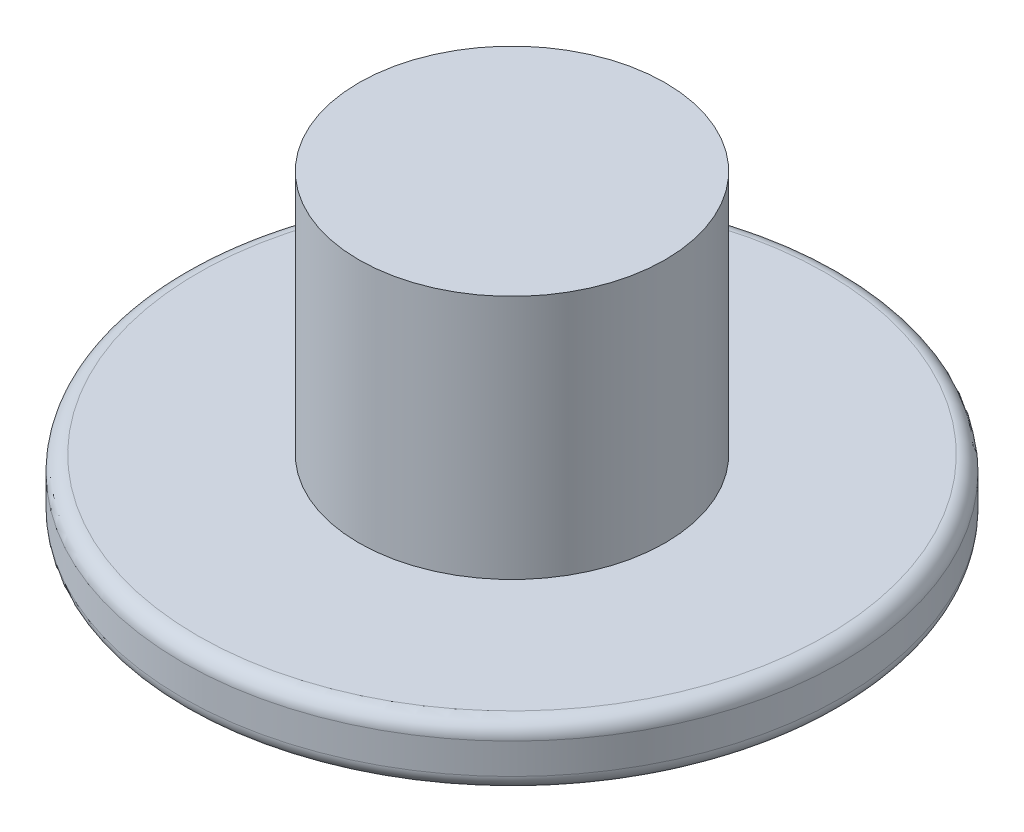
ISO-10303-21;
HEADER;
FILE_DESCRIPTION(('STEP AP214'),'2;1');
FILE_NAME('part.step','',(''),(''),'','','');
FILE_SCHEMA(('AUTOMOTIVE_DESIGN { 1 0 10303 214 1 1 1 1 }'));
ENDSEC;
DATA;
#1=APPLICATION_CONTEXT('core data for automotive mechanical design processes');
#2=APPLICATION_PROTOCOL_DEFINITION('international standard','automotive_design',2000,#1);
#3=PRODUCT_CONTEXT('',#1,'mechanical');
#4=PRODUCT('Part','Part','',(#3));
#5=PRODUCT_RELATED_PRODUCT_CATEGORY('part','',(#4));
#6=PRODUCT_DEFINITION_FORMATION('','',#4);
#7=PRODUCT_DEFINITION_CONTEXT('part definition',#1,'design');
#8=PRODUCT_DEFINITION('design','',#6,#7);
#9=PRODUCT_DEFINITION_SHAPE('','',#8);
#10=(LENGTH_UNIT() NAMED_UNIT(*) SI_UNIT(.MILLI.,.METRE.));
#11=(NAMED_UNIT(*) PLANE_ANGLE_UNIT() SI_UNIT($,.RADIAN.));
#12=(NAMED_UNIT(*) SI_UNIT($,.STERADIAN.) SOLID_ANGLE_UNIT());
#13=UNCERTAINTY_MEASURE_WITH_UNIT(LENGTH_MEASURE(1.E-05),#10,'distance_accuracy_value','');
#14=(GEOMETRIC_REPRESENTATION_CONTEXT(3) GLOBAL_UNCERTAINTY_ASSIGNED_CONTEXT((#13)) GLOBAL_UNIT_ASSIGNED_CONTEXT((#10,
#11,#12)) REPRESENTATION_CONTEXT('',''));
#15=CARTESIAN_POINT('',(0.,0.,0.));
#16=DIRECTION('',(0.,0.,1.));
#17=DIRECTION('',(1.,0.,0.));
#18=AXIS2_PLACEMENT_3D('',#15,#16,#17);
#19=CARTESIAN_POINT('',(-5.40867619744746,0.,40.306737900425));
#20=DIRECTION('',(0.,1.,0.));
#21=DIRECTION('',(0.,0.,1.));
#22=AXIS2_PLACEMENT_3D('',#19,#20,#21);
#23=PLANE('',#22);
#24=CARTESIAN_POINT('',(-5.40867619744746,0.,40.306737900425));
#25=DIRECTION('',(0.,1.,0.));
#26=DIRECTION('',(0.,0.,1.));
#27=AXIS2_PLACEMENT_3D('',#24,#25,#26);
#28=CIRCLE('',#27,10.25);
#29=CARTESIAN_POINT('',(-5.40867619744746,0.,50.556737900425));
#30=VERTEX_POINT('',#29);
#31=EDGE_CURVE('E11',#30,#30,#28,.F.);
#32=ORIENTED_EDGE('',*,*,#31,.T.);
#33=EDGE_LOOP('',(#32));
#34=FACE_BOUND('',#33,.T.);
#35=DIRECTION('',(1.,0.,0.));
#36=VECTOR('',#35,1.);
#37=CARTESIAN_POINT('',(-6.73019068146306,0.,44.8370687061921));
#38=LINE('',#37,#36);
#39=CARTESIAN_POINT('',(-6.73019068146306,0.,44.8370687061921));
#40=VERTEX_POINT('',#39);
#41=CARTESIAN_POINT('',(-1.1192131173605,0.,44.8370687061921));
#42=VERTEX_POINT('',#41);
#43=EDGE_CURVE('E55',#40,#42,#38,.T.);
#44=ORIENTED_EDGE('',*,*,#43,.T.);
#45=DIRECTION('',(0.,0.,-1.));
#46=VECTOR('',#45,1.);
#47=CARTESIAN_POINT('',(-1.1192131173605,0.,44.8370687061921));
#48=LINE('',#47,#46);
#49=CARTESIAN_POINT('',(-1.1192131173605,0.,43.6832225523459));
#50=VERTEX_POINT('',#49);
#51=EDGE_CURVE('E383',#42,#50,#48,.T.);
#52=ORIENTED_EDGE('',*,*,#51,.T.);
#53=DIRECTION('',(-1.,0.,0.));
#54=VECTOR('',#53,1.);
#55=CARTESIAN_POINT('',(-1.1192131173605,0.,43.6832225523459));
#56=LINE('',#55,#54);
#57=CARTESIAN_POINT('',(-5.34397273274512,0.,43.6832225523459));
#58=VERTEX_POINT('',#57);
#59=EDGE_CURVE('E386',#50,#58,#56,.T.);
#60=ORIENTED_EDGE('',*,*,#59,.T.);
#61=DIRECTION('',(-0.27333643752184,0.,-0.961918495467713));
#62=VECTOR('',#61,1.);
#63=CARTESIAN_POINT('',(-5.34397273274512,0.,43.6832225523459));
#64=LINE('',#63,#62);
#65=CARTESIAN_POINT('',(-6.02305927120665,0.,41.2933988343972));
#66=VERTEX_POINT('',#65);
#67=EDGE_CURVE('E391',#58,#66,#64,.T.);
#68=ORIENTED_EDGE('',*,*,#67,.T.);
#69=CARTESIAN_POINT('',(-6.02305927120665,0.,41.2933988343972));
#70=CARTESIAN_POINT('',(-5.93215657111115,0.,41.3260066823905));
#71=CARTESIAN_POINT('',(-5.74832799375601,0.,41.3919481153833));
#72=CARTESIAN_POINT('',(-5.45735597615816,0.,41.4570733809796));
#73=CARTESIAN_POINT('',(-5.1526801826961,0.,41.4949218039044));
#74=CARTESIAN_POINT('',(-4.94477683204518,0.,41.5007664036376));
#75=CARTESIAN_POINT('',(-4.83916504043742,0.,41.5037353728588));
#76=B_SPLINE_CURVE_WITH_KNOTS('',3,(#69,#70,#71,#72,#73,#74,#75),.UNSPECIFIED.,.F.,.F.,(4,1,1,1,
4),(0.,0.239429262692697,0.484187385982473,0.737974909352279,1.),.UNSPECIFIED.);
#77=CARTESIAN_POINT('',(-4.83916504043742,0.,41.5037353728588));
#78=VERTEX_POINT('',#77);
#79=EDGE_CURVE('E395',#66,#78,#76,.T.);
#80=ORIENTED_EDGE('',*,*,#79,.T.);
#81=CARTESIAN_POINT('',(-4.83916504043742,0.,41.5037353728588));
#82=CARTESIAN_POINT('',(-4.6927948440553,0.,41.5015117046549));
#83=CARTESIAN_POINT('',(-4.40530243396048,0.,41.4971440960365));
#84=CARTESIAN_POINT('',(-3.98491468512495,0.,41.4490227793062));
#85=CARTESIAN_POINT('',(-3.5841143930784,0.,41.3760350578371));
#86=CARTESIAN_POINT('',(-3.20340957642049,0.,41.2724287059942));
#87=CARTESIAN_POINT('',(-2.84410494047985,0.,41.1349601433638));
#88=CARTESIAN_POINT('',(-2.50342224904487,0.,40.9708336778564));
#89=CARTESIAN_POINT('',(-2.18343063076139,0.,40.7755046147159));
#90=CARTESIAN_POINT('',(-1.88673504524433,0.,40.5522039643542));
#91=CARTESIAN_POINT('',(-1.61761416693961,0.,40.3075602114748));
#92=CARTESIAN_POINT('',(-1.38056250436114,0.,40.0462120709497));
#93=CARTESIAN_POINT('',(-1.18207177955775,0.,39.76870832662));
#94=CARTESIAN_POINT('',(-1.0165866631122,0.,39.4774777608867));
#95=CARTESIAN_POINT('',(-0.891019309772605,0.,39.1701050934345));
#96=CARTESIAN_POINT('',(-0.800035696125023,0.,38.848376848342));
#97=CARTESIAN_POINT('',(-0.744603565608385,0.,38.5122000800234));
#98=CARTESIAN_POINT('',(-0.737965639625989,0.,38.282791456088));
#99=CARTESIAN_POINT('',(-0.734597732745115,0.,38.166395629269));
#100=B_SPLINE_CURVE_WITH_KNOTS('',3,(#81,#82,#83,#84,#85,#86,#87,#88,#89,#90,#91,#92,#93,#94,
#95,#96,#97,#98,#99),.UNSPECIFIED.,.F.,.F.,(4,1,1,1,1,1,1,1,1,1,1,1,1,1,1,1,4),(0.,
0.0743389245753018,0.146012488322517,0.214685074506793,0.281190543308888,0.346155068067732,
0.409885297502125,0.473075910884056,0.536316597878801,0.59827844891465,0.657616470310781,
0.715238120651402,0.771292284799635,0.827429553758731,0.883492957858258,0.940887429305456,1.),.UNSPECIFIED.);
#101=CARTESIAN_POINT('',(-0.734597732745115,0.,38.166395629269));
#102=VERTEX_POINT('',#101);
#103=EDGE_CURVE('E401',#78,#102,#100,.T.);
#104=ORIENTED_EDGE('',*,*,#103,.T.);
#105=CARTESIAN_POINT('',(-0.734597732745115,0.,38.166395629269));
#106=CARTESIAN_POINT('',(-0.736640176708579,0.,38.085517838444));
#107=CARTESIAN_POINT('',(-0.740703433824927,0.,37.9246188052256));
#108=CARTESIAN_POINT('',(-0.769785302849158,0.,37.6855396597018));
#109=CARTESIAN_POINT('',(-0.815472566024547,0.,37.4510645665252));
#110=CARTESIAN_POINT('',(-0.880132403892247,0.,37.2204997671261));
#111=CARTESIAN_POINT('',(-0.96412582099436,0.,36.9948085430344));
#112=CARTESIAN_POINT('',(-1.06783673984658,0.,36.7731466929799));
#113=CARTESIAN_POINT('',(-1.18705446464345,0.,36.5544348686205));
#114=CARTESIAN_POINT('',(-1.32771342288352,0.,36.3429885347051));
#115=CARTESIAN_POINT('',(-1.48406860437464,0.,36.1398632955829));
#116=CARTESIAN_POINT('',(-1.65127487718054,0.,35.9438898850625));
#117=CARTESIAN_POINT('',(-1.83698238790032,0.,35.7638483966773));
#118=CARTESIAN_POINT('',(-2.03629724836563,0.,35.5952945193468));
#119=CARTESIAN_POINT('',(-2.24765163916629,0.,35.4369335975072));
#120=CARTESIAN_POINT('',(-2.47453894318062,0.,35.2921645696468));
#121=CARTESIAN_POINT('',(-2.71396984655679,0.,35.1575764293281));
#122=CARTESIAN_POINT('',(-2.96910054443274,0.,35.0383196757167));
#123=CARTESIAN_POINT('',(-3.23450294933087,0.,34.9305693633146));
#124=CARTESIAN_POINT('',(-3.51018020912839,0.,34.8350953287018));
#125=CARTESIAN_POINT('',(-3.79637120120223,0.,34.7581644610804));
#126=CARTESIAN_POINT('',(-4.09203422681157,0.,34.6943677218742));
#127=CARTESIAN_POINT('',(-4.39652846494206,0.,34.6413106249043));
#128=CARTESIAN_POINT('',(-4.71090790143422,0.,34.605736686545));
#129=CARTESIAN_POINT('',(-5.03522687383082,0.,34.5861160931961));
#130=CARTESIAN_POINT('',(-5.25447061639936,0.,34.5824987338237));
#131=CARTESIAN_POINT('',(-5.36600798915537,0.,34.5806584497818));
#132=B_SPLINE_CURVE_WITH_KNOTS('',3,(#105,#106,#107,#108,#109,#110,#111,#112,#113,#114,#115,
#116,#117,#118,#119,#120,#121,#122,#123,#124,#125,#126,#127,#128,#129,#130,#131),.UNSPECIFIED.,
.F.,.F.,(4,1,1,1,1,1,1,1,1,1,1,1,1,1,1,1,1,1,1,1,1,1,1,1,4),(0.,0.0371714568856347,
0.0739492438555975,0.110548562269402,0.146892145996795,0.183894672594179,0.221110457371372,
0.259300773030149,0.298290633884369,0.337703474048405,0.377088815071421,0.416592385829035,
0.456443813643032,0.497021491109182,0.537889512706286,0.580074529466974,0.623187334398457,
0.667246883884079,0.711703436595568,0.757198971041948,0.803375874273611,0.850708398715815,
0.899213688248716,0.948726288418507,1.),.UNSPECIFIED.);
#133=CARTESIAN_POINT('',(-5.36600798915537,0.,34.5806584497818));
#134=VERTEX_POINT('',#133);
#135=EDGE_CURVE('E410',#102,#134,#132,.T.);
#136=ORIENTED_EDGE('',*,*,#135,.T.);
#137=CARTESIAN_POINT('',(-5.36600798915537,0.,34.5806584497819));
#138=CARTESIAN_POINT('',(-5.49428448627442,0.,34.583063857957));
#139=CARTESIAN_POINT('',(-5.7459559564439,0.,34.5877831372123));
#140=CARTESIAN_POINT('',(-6.11618420193414,0.,34.6220348205228));
#141=CARTESIAN_POINT('',(-6.47081652048435,0.,34.6801783982232));
#142=CARTESIAN_POINT('',(-6.81126631620235,0.,34.7598845139597));
#143=CARTESIAN_POINT('',(-7.1368932364796,0.,34.8642338454057));
#144=CARTESIAN_POINT('',(-7.44756847050547,0.,34.9925641976192));
#145=CARTESIAN_POINT('',(-7.7430905227615,0.,35.1431432902438));
#146=CARTESIAN_POINT('',(-8.02175502307017,0.,35.3151196060361));
#147=CARTESIAN_POINT('',(-8.2802632831459,0.,35.5077495311885));
#148=CARTESIAN_POINT('',(-8.51132832701484,0.,35.7238222338236));
#149=CARTESIAN_POINT('',(-8.71730290700243,0.,35.9563985513301));
#150=CARTESIAN_POINT('',(-8.89412481187854,0.,36.2089896982644));
#151=CARTESIAN_POINT('',(-9.0461122197022,0.,36.4787574043959));
#152=CARTESIAN_POINT('',(-9.16773086314077,0.,36.7686954136162));
#153=CARTESIAN_POINT('',(-9.26333166459999,0.,37.0774077643959));
#154=CARTESIAN_POINT('',(-9.30373865943081,0.,37.2918379179483));
#155=CARTESIAN_POINT('',(-9.32434132248871,0.,37.4011712702947));
#156=B_SPLINE_CURVE_WITH_KNOTS('',3,(#137,#138,#139,#140,#141,#142,#143,#144,#145,#146,#147,
#148,#149,#150,#151,#152,#153,#154,#155),.UNSPECIFIED.,.F.,.F.,(4,1,1,1,1,1,1,1,1,1,1,1,1,1,1,1,
4),(0.,0.0722550693364355,0.141760493430237,0.20922582661214,0.274550614369714,
0.338548322441237,0.401625248301819,0.46369940891637,0.525181550155835,0.585891378212693,
0.644976062496838,0.703077965727782,0.760578940010147,0.81834014546035,0.877164440445626,
0.93736877351003,1.),.UNSPECIFIED.);
#157=CARTESIAN_POINT('',(-9.32434132248871,0.,37.4011712702947));
#158=VERTEX_POINT('',#157);
#159=EDGE_CURVE('E419',#134,#158,#156,.T.);
#160=ORIENTED_EDGE('',*,*,#159,.T.);
#161=DIRECTION('',(1.,0.,0.));
#162=VECTOR('',#161,1.);
#163=CARTESIAN_POINT('',(-9.32434132248871,0.,37.4011712702947));
#164=LINE('',#163,#162);
#165=CARTESIAN_POINT('',(-7.69573555325794,0.,37.4011712702947));
#166=VERTEX_POINT('',#165);
#167=EDGE_CURVE('E428',#158,#166,#164,.T.);
#168=ORIENTED_EDGE('',*,*,#167,.T.);
#169=CARTESIAN_POINT('',(-7.69573555325794,0.,37.4011712702947));
#170=CARTESIAN_POINT('',(-7.6659388415858,0.,37.2982277299299));
#171=CARTESIAN_POINT('',(-7.60942475923508,0.,37.1029793487776));
#172=CARTESIAN_POINT('',(-7.49438667741095,0.,36.8371311331461));
#173=CARTESIAN_POINT('',(-7.36557869267887,0.,36.6106821435882));
#174=CARTESIAN_POINT('',(-7.21298136460262,0.,36.4246477011935));
#175=CARTESIAN_POINT('',(-7.03724454167315,0.,36.2711862733975));
#176=CARTESIAN_POINT('',(-6.83788668293426,0.,36.1400331030069));
#177=CARTESIAN_POINT('',(-6.61753110984514,0.,36.0180322380898));
#178=CARTESIAN_POINT('',(-6.37223107237868,0.,35.9184550204022));
#179=CARTESIAN_POINT('',(-6.11302822056004,0.,35.8367159002311));
#180=CARTESIAN_POINT('',(-5.8440518502742,0.,35.7789765210099));
#181=CARTESIAN_POINT('',(-5.56940602731092,0.,35.7411853601481));
#182=CARTESIAN_POINT('',(-5.38349392346399,0.,35.7367419062204));
#183=CARTESIAN_POINT('',(-5.28988619428358,0.,35.734504603628));
#184=B_SPLINE_CURVE_WITH_KNOTS('',3,(#169,#170,#171,#172,#173,#174,#175,#176,#177,#178,#179,
#180,#181,#182,#183),.UNSPECIFIED.,.F.,.F.,(4,1,1,1,1,1,1,1,1,1,1,1,4),(0.,0.100791051963254,
0.191165853250663,0.27201810378698,0.345255267649142,0.416507285315301,0.490772991013227,
0.569531127070008,0.65322621517471,0.739506009827779,0.825068479735341,0.911921052824323,1.),.UNSPECIFIED.);
#185=CARTESIAN_POINT('',(-5.28988619428358,0.,35.734504603628));
#186=VERTEX_POINT('',#185);
#187=EDGE_CURVE('E435',#166,#186,#184,.T.);
#188=ORIENTED_EDGE('',*,*,#187,.T.);
#189=CARTESIAN_POINT('',(-5.28988619428358,0.,35.734504603628));
#190=CARTESIAN_POINT('',(-5.19232400485212,0.,35.7371308106666));
#191=CARTESIAN_POINT('',(-5.00001608623491,0.,35.7423074104578));
#192=CARTESIAN_POINT('',(-4.71691034473578,0.,35.7737505793307));
#193=CARTESIAN_POINT('',(-4.4449659311084,0.,35.8305591133987));
#194=CARTESIAN_POINT('',(-4.18350813090624,0.,35.9087701891085));
#195=CARTESIAN_POINT('',(-3.93247715919748,0.,36.0087804418865));
#196=CARTESIAN_POINT('',(-3.69275479914498,0.,36.1321229679419));
#197=CARTESIAN_POINT('',(-3.46376649605635,0.,36.2763868965542));
#198=CARTESIAN_POINT('',(-3.24901409277233,0.,36.4419556021416));
#199=CARTESIAN_POINT('',(-3.05146790974454,0.,36.623085173375));
#200=CARTESIAN_POINT('',(-2.8760184649891,0.,36.8160022228656));
#201=CARTESIAN_POINT('',(-2.73088097116678,0.,37.0236889638669));
#202=CARTESIAN_POINT('',(-2.6090820006183,0.,37.239620566169));
#203=CARTESIAN_POINT('',(-2.51776177272255,0.,37.4685644527969));
#204=CARTESIAN_POINT('',(-2.44745588639938,0.,37.7054284544355));
#205=CARTESIAN_POINT('',(-2.41020035351009,0.,37.954886601776));
#206=CARTESIAN_POINT('',(-2.40427985968689,0.,38.1242201808337));
#207=CARTESIAN_POINT('',(-2.40126439941178,0.,38.2104661420895));
#208=B_SPLINE_CURVE_WITH_KNOTS('',3,(#189,#190,#191,#192,#193,#194,#195,#196,#197,#198,#199,
#200,#201,#202,#203,#204,#205,#206,#207),.UNSPECIFIED.,.F.,.F.,(4,1,1,1,1,1,1,1,1,1,1,1,1,1,1,1,
4),(0.,0.0691660997840869,0.136335487814075,0.201596475431935,0.265840184658442,
0.329565649797417,0.392862493107134,0.456684571921118,0.52115804696228,0.584807875628129,
0.646484027775238,0.705581540802134,0.764061651384216,0.821811177654662,0.879937745098238,
0.938849195521886,1.),.UNSPECIFIED.);
#209=CARTESIAN_POINT('',(-2.40126439941178,0.,38.2104661420895));
#210=VERTEX_POINT('',#209);
#211=EDGE_CURVE('E441',#186,#210,#208,.T.);
#212=ORIENTED_EDGE('',*,*,#211,.T.);
#213=CARTESIAN_POINT('',(-2.40126439941178,0.,38.2104661420895));
#214=CARTESIAN_POINT('',(-2.40349869004694,0.,38.2873966041747));
#215=CARTESIAN_POINT('',(-2.40789561081065,0.,38.4387901340862));
#216=CARTESIAN_POINT('',(-2.44492134610032,0.,38.6607096451391));
#217=CARTESIAN_POINT('',(-2.50534816984183,0.,38.8714212778116));
#218=CARTESIAN_POINT('',(-2.58686473561244,0.,39.0724804067537));
#219=CARTESIAN_POINT('',(-2.6975292165411,0.,39.2591245665785));
#220=CARTESIAN_POINT('',(-2.82817575057708,0.,39.4377812787495));
#221=CARTESIAN_POINT('',(-2.98541285842316,0.,39.6032635850109));
#222=CARTESIAN_POINT('',(-3.16407031568093,0.,39.7572458112678));
#223=CARTESIAN_POINT('',(-3.36148755009186,0.,39.8981960904131));
#224=CARTESIAN_POINT('',(-3.57994685646756,0.,40.0171557767739));
#225=CARTESIAN_POINT('',(-3.81224482640179,0.,40.122529309504));
#226=CARTESIAN_POINT('',(-4.06200297311973,0.,40.2063677259609));
#227=CARTESIAN_POINT('',(-4.32827545991193,0.,40.2701501543734));
#228=CARTESIAN_POINT('',(-4.61088507935938,0.,40.3155010777753));
#229=CARTESIAN_POINT('',(-4.91069584311887,0.,40.3441339255054));
#230=CARTESIAN_POINT('',(-5.11620844447298,0.,40.3479360989186));
#231=CARTESIAN_POINT('',(-5.2217772199246,0.,40.3498892190126));
#232=B_SPLINE_CURVE_WITH_KNOTS('',3,(#213,#214,#215,#216,#217,#218,#219,#220,#221,#222,#223,
#224,#225,#226,#227,#228,#229,#230,#231),.UNSPECIFIED.,.F.,.F.,(4,1,1,1,1,1,1,1,1,1,1,1,1,1,1,1,
4),(0.,0.0581373940885404,0.114410144854963,0.169541239761174,0.223638615135225,
0.277931165434447,0.333163876050872,0.390666496037748,0.450080977408535,0.511293582496558,
0.573667296196432,0.637845580387909,0.703941223496274,0.772512473876621,0.84463798870978,
0.920192838903585,1.),.UNSPECIFIED.);
#233=CARTESIAN_POINT('',(-5.2217772199246,0.,40.3498892190126));
#234=VERTEX_POINT('',#233);
#235=EDGE_CURVE('E286',#210,#234,#232,.T.);
#236=ORIENTED_EDGE('',*,*,#235,.T.);
#237=CARTESIAN_POINT('',(-5.2217772199246,0.,40.3498892190126));
#238=CARTESIAN_POINT('',(-5.31330391590836,0.,40.3482221889726));
#239=CARTESIAN_POINT('',(-5.50398838972643,0.,40.3447491394693));
#240=CARTESIAN_POINT('',(-5.8013938294988,0.,40.3188607613492));
#241=CARTESIAN_POINT('',(-6.12083083275314,0.,40.2789986334368));
#242=CARTESIAN_POINT('',(-6.46276668592762,0.,40.2218356005668));
#243=CARTESIAN_POINT('',(-6.82624090627356,0.,40.1499762183534));
#244=CARTESIAN_POINT('',(-7.21208024506142,0.,40.0607047983026));
#245=CARTESIAN_POINT('',(-7.62032289715651,0.,39.9570407218115));
#246=CARTESIAN_POINT('',(-7.8989169337311,0.,39.8778319762027));
#247=CARTESIAN_POINT('',(-8.04229004043742,0.,39.8370687061921));
#248=B_SPLINE_CURVE_WITH_KNOTS('',3,(#237,#238,#239,#240,#241,#242,#243,#244,#245,#246,#247),
.UNSPECIFIED.,.F.,.F.,(4,1,1,1,1,1,1,1,4),(0.,0.0954896794505595,0.19894085638488,
0.311281655738479,0.43131780288065,0.560575456717941,0.697811029272937,0.844484210508486,1.),.UNSPECIFIED.);
#249=CARTESIAN_POINT('',(-8.04229004043742,0.,39.8370687061921));
#250=VERTEX_POINT('',#249);
#251=EDGE_CURVE('E166',#234,#250,#248,.T.);
#252=ORIENTED_EDGE('',*,*,#251,.T.);
#253=DIRECTION('',(0.253825619930976,0.,0.967249995950713));
#254=VECTOR('',#253,1.);
#255=CARTESIAN_POINT('',(-8.04229004043742,0.,39.8370687061921));
#256=LINE('',#255,#254);
#257=EDGE_CURVE('E279',#250,#40,#256,.T.);
#258=ORIENTED_EDGE('',*,*,#257,.T.);
#259=EDGE_LOOP('',(#44,#52,#60,#68,#80,#104,#136,#160,#168,#188,#212,#236,#252,#258));
#260=FACE_BOUND('',#259,.T.);
#261=ADVANCED_FACE('F39',(#34,#260),#23,.F.);
#262=CARTESIAN_POINT('',(-5.40867619744746,2.,40.306737900425));
#263=DIRECTION('',(0.,-1.,0.));
#264=DIRECTION('',(0.,0.,-1.));
#265=AXIS2_PLACEMENT_3D('',#262,#263,#264);
#266=CYLINDRICAL_SURFACE('',#265,10.75);
#267=CARTESIAN_POINT('',(-5.40867619744746,1.5,40.306737900425));
#268=DIRECTION('',(0.,1.,0.));
#269=DIRECTION('',(0.,0.,1.));
#270=AXIS2_PLACEMENT_3D('',#267,#268,#269);
#271=CIRCLE('',#270,10.75);
#272=CARTESIAN_POINT('',(-5.40867619744746,1.5,51.056737900425));
#273=VERTEX_POINT('',#272);
#274=EDGE_CURVE('E48',#273,#273,#271,.F.);
#275=ORIENTED_EDGE('',*,*,#274,.T.);
#276=EDGE_LOOP('',(#275));
#277=FACE_BOUND('',#276,.T.);
#278=CARTESIAN_POINT('',(-5.40867619744746,0.5,40.306737900425));
#279=DIRECTION('',(0.,1.,0.));
#280=DIRECTION('',(0.,0.,1.));
#281=AXIS2_PLACEMENT_3D('',#278,#279,#280);
#282=CIRCLE('',#281,10.75);
#283=CARTESIAN_POINT('',(-5.40867619744746,0.5,51.056737900425));
#284=VERTEX_POINT('',#283);
#285=EDGE_CURVE('E340',#284,#284,#282,.T.);
#286=ORIENTED_EDGE('',*,*,#285,.T.);
#287=EDGE_LOOP('',(#286));
#288=FACE_BOUND('',#287,.T.);
#289=ADVANCED_FACE('F347',(#277,#288),#266,.T.);
#290=CARTESIAN_POINT('',(-5.40867619744746,2.,40.306737900425));
#291=DIRECTION('',(0.,1.,0.));
#292=DIRECTION('',(0.,0.,1.));
#293=AXIS2_PLACEMENT_3D('',#290,#291,#292);
#294=PLANE('',#293);
#295=CARTESIAN_POINT('',(-5.40867619744746,2.,40.306737900425));
#296=DIRECTION('',(0.,1.,0.));
#297=DIRECTION('',(0.,0.,1.));
#298=AXIS2_PLACEMENT_3D('',#295,#296,#297);
#299=CIRCLE('',#298,10.25);
#300=CARTESIAN_POINT('',(-5.40867619744746,2.,50.556737900425));
#301=VERTEX_POINT('',#300);
#302=EDGE_CURVE('E336',#301,#301,#299,.T.);
#303=ORIENTED_EDGE('',*,*,#302,.T.);
#304=EDGE_LOOP('',(#303));
#305=FACE_BOUND('',#304,.T.);
#306=CARTESIAN_POINT('',(-5.40867619744746,2.,40.306737900425));
#307=DIRECTION('',(0.,1.,0.));
#308=DIRECTION('',(0.,0.,1.));
#309=AXIS2_PLACEMENT_3D('',#306,#307,#308);
#310=CIRCLE('',#309,5.);
#311=CARTESIAN_POINT('',(-5.40867619744746,2.,45.306737900425));
#312=VERTEX_POINT('',#311);
#313=EDGE_CURVE('E332',#312,#312,#310,.T.);
#314=ORIENTED_EDGE('',*,*,#313,.F.);
#315=EDGE_LOOP('',(#314));
#316=FACE_BOUND('',#315,.T.);
#317=ADVANCED_FACE('F355',(#305,#316),#294,.T.);
#318=CARTESIAN_POINT('',(-5.40867619744746,10.,40.306737900425));
#319=DIRECTION('',(0.,-1.,0.));
#320=DIRECTION('',(0.,0.,-1.));
#321=AXIS2_PLACEMENT_3D('',#318,#319,#320);
#322=CYLINDRICAL_SURFACE('',#321,5.);
#323=CARTESIAN_POINT('',(-5.40867619744746,10.,40.306737900425));
#324=DIRECTION('',(0.,1.,0.));
#325=DIRECTION('',(0.,0.,1.));
#326=AXIS2_PLACEMENT_3D('',#323,#324,#325);
#327=CIRCLE('',#326,5.);
#328=CARTESIAN_POINT('',(-5.40867619744746,10.,45.306737900425));
#329=VERTEX_POINT('',#328);
#330=EDGE_CURVE('E328',#329,#329,#327,.T.);
#331=ORIENTED_EDGE('',*,*,#330,.F.);
#332=EDGE_LOOP('',(#331));
#333=FACE_BOUND('',#332,.T.);
#334=ORIENTED_EDGE('',*,*,#313,.T.);
#335=EDGE_LOOP('',(#334));
#336=FACE_BOUND('',#335,.T.);
#337=ADVANCED_FACE('F358',(#333,#336),#322,.T.);
#338=CARTESIAN_POINT('',(-5.40867619744746,10.,40.306737900425));
#339=DIRECTION('',(0.,1.,0.));
#340=DIRECTION('',(0.,0.,1.));
#341=AXIS2_PLACEMENT_3D('',#338,#339,#340);
#342=PLANE('',#341);
#343=ORIENTED_EDGE('',*,*,#330,.T.);
#344=EDGE_LOOP('',(#343));
#345=FACE_BOUND('',#344,.T.);
#346=ADVANCED_FACE('F363',(#345),#342,.T.);
#347=CARTESIAN_POINT('',(-6.73019068146306,0.5,44.8370687061921));
#348=DIRECTION('',(0.,0.,-1.));
#349=DIRECTION('',(-1.,0.,0.));
#350=AXIS2_PLACEMENT_3D('',#347,#348,#349);
#351=PLANE('',#350);
#352=ORIENTED_EDGE('',*,*,#43,.F.);
#353=DIRECTION('',(0.,-1.,0.));
#354=VECTOR('',#353,1.);
#355=CARTESIAN_POINT('',(-6.73019068146306,0.5,44.8370687061921));
#356=LINE('',#355,#354);
#357=CARTESIAN_POINT('',(-6.73019068146306,0.5,44.8370687061921));
#358=VERTEX_POINT('',#357);
#359=EDGE_CURVE('E174',#358,#40,#356,.T.);
#360=ORIENTED_EDGE('',*,*,#359,.F.);
#361=DIRECTION('',(1.,0.,0.));
#362=VECTOR('',#361,1.);
#363=CARTESIAN_POINT('',(-6.73019068146306,0.5,44.8370687061921));
#364=LINE('',#363,#362);
#365=CARTESIAN_POINT('',(-1.1192131173605,0.5,44.8370687061921));
#366=VERTEX_POINT('',#365);
#367=EDGE_CURVE('E277',#358,#366,#364,.T.);
#368=ORIENTED_EDGE('',*,*,#367,.T.);
#369=DIRECTION('',(0.,-1.,0.));
#370=VECTOR('',#369,1.);
#371=CARTESIAN_POINT('',(-1.1192131173605,0.5,44.8370687061921));
#372=LINE('',#371,#370);
#373=EDGE_CURVE('E325',#366,#42,#372,.T.);
#374=ORIENTED_EDGE('',*,*,#373,.T.);
#375=EDGE_LOOP('',(#352,#360,#368,#374));
#376=FACE_BOUND('',#375,.T.);
#377=ADVANCED_FACE('F369',(#376),#351,.T.);
#378=CARTESIAN_POINT('',(-1.1192131173605,0.5,44.8370687061921));
#379=DIRECTION('',(-1.,0.,0.));
#380=DIRECTION('',(0.,0.,1.));
#381=AXIS2_PLACEMENT_3D('',#378,#379,#380);
#382=PLANE('',#381);
#383=ORIENTED_EDGE('',*,*,#51,.F.);
#384=ORIENTED_EDGE('',*,*,#373,.F.);
#385=DIRECTION('',(0.,0.,-1.));
#386=VECTOR('',#385,1.);
#387=CARTESIAN_POINT('',(-1.1192131173605,0.5,44.8370687061921));
#388=LINE('',#387,#386);
#389=CARTESIAN_POINT('',(-1.1192131173605,0.5,43.6832225523459));
#390=VERTEX_POINT('',#389);
#391=EDGE_CURVE('E118',#366,#390,#388,.T.);
#392=ORIENTED_EDGE('',*,*,#391,.T.);
#393=DIRECTION('',(0.,-1.,0.));
#394=VECTOR('',#393,1.);
#395=CARTESIAN_POINT('',(-1.1192131173605,0.5,43.6832225523459));
#396=LINE('',#395,#394);
#397=EDGE_CURVE('E322',#390,#50,#396,.T.);
#398=ORIENTED_EDGE('',*,*,#397,.T.);
#399=EDGE_LOOP('',(#383,#384,#392,#398));
#400=FACE_BOUND('',#399,.T.);
#401=ADVANCED_FACE('F492',(#400),#382,.T.);
#402=CARTESIAN_POINT('',(-1.1192131173605,0.5,43.6832225523459));
#403=DIRECTION('',(0.,0.,1.));
#404=DIRECTION('',(1.,0.,0.));
#405=AXIS2_PLACEMENT_3D('',#402,#403,#404);
#406=PLANE('',#405);
#407=ORIENTED_EDGE('',*,*,#59,.F.);
#408=ORIENTED_EDGE('',*,*,#397,.F.);
#409=DIRECTION('',(-1.,0.,0.));
#410=VECTOR('',#409,1.);
#411=CARTESIAN_POINT('',(-1.1192131173605,0.5,43.6832225523459));
#412=LINE('',#411,#410);
#413=CARTESIAN_POINT('',(-5.34397273274512,0.5,43.6832225523459));
#414=VERTEX_POINT('',#413);
#415=EDGE_CURVE('E272',#390,#414,#412,.T.);
#416=ORIENTED_EDGE('',*,*,#415,.T.);
#417=DIRECTION('',(0.,-1.,0.));
#418=VECTOR('',#417,1.);
#419=CARTESIAN_POINT('',(-5.34397273274512,0.5,43.6832225523459));
#420=LINE('',#419,#418);
#421=EDGE_CURVE('E319',#414,#58,#420,.T.);
#422=ORIENTED_EDGE('',*,*,#421,.T.);
#423=EDGE_LOOP('',(#407,#408,#416,#422));
#424=FACE_BOUND('',#423,.T.);
#425=ADVANCED_FACE('F489',(#424),#406,.T.);
#426=CARTESIAN_POINT('',(-5.34397273274512,0.5,43.6832225523459));
#427=DIRECTION('',(-0.961918495467713,0.,0.27333643752184));
#428=DIRECTION('',(0.27333643752184,0.,0.961918495467713));
#429=AXIS2_PLACEMENT_3D('',#426,#427,#428);
#430=PLANE('',#429);
#431=ORIENTED_EDGE('',*,*,#67,.F.);
#432=ORIENTED_EDGE('',*,*,#421,.F.);
#433=DIRECTION('',(-0.27333643752184,0.,-0.961918495467713));
#434=VECTOR('',#433,1.);
#435=CARTESIAN_POINT('',(-5.34397273274512,0.5,43.6832225523459));
#436=LINE('',#435,#434);
#437=CARTESIAN_POINT('',(-6.02305927120665,0.5,41.2933988343972));
#438=VERTEX_POINT('',#437);
#439=EDGE_CURVE('E266',#414,#438,#436,.T.);
#440=ORIENTED_EDGE('',*,*,#439,.T.);
#441=DIRECTION('',(0.,-1.,0.));
#442=VECTOR('',#441,1.);
#443=CARTESIAN_POINT('',(-6.02305927120665,0.5,41.2933988343972));
#444=LINE('',#443,#442);
#445=EDGE_CURVE('E316',#438,#66,#444,.T.);
#446=ORIENTED_EDGE('',*,*,#445,.T.);
#447=EDGE_LOOP('',(#431,#432,#440,#446));
#448=FACE_BOUND('',#447,.T.);
#449=ADVANCED_FACE('F486',(#448),#430,.T.);
#450=CARTESIAN_POINT('',(-6.02305927120665,0.5,41.2933988343972));
#451=CARTESIAN_POINT('',(-5.93215657111115,0.5,41.3260066823905));
#452=CARTESIAN_POINT('',(-5.74832799375601,0.5,41.3919481153833));
#453=CARTESIAN_POINT('',(-5.45735597615816,0.5,41.4570733809796));
#454=CARTESIAN_POINT('',(-5.1526801826961,0.5,41.4949218039044));
#455=CARTESIAN_POINT('',(-4.94477683204518,0.5,41.5007664036376));
#456=CARTESIAN_POINT('',(-4.83916504043742,0.5,41.5037353728588));
#457=B_SPLINE_CURVE_WITH_KNOTS('',3,(#450,#451,#452,#453,#454,#455,#456),.UNSPECIFIED.,.F.,.F.,
(4,1,1,1,4),(0.,0.239429262692697,0.484187385982473,0.737974909352279,1.),.UNSPECIFIED.);
#458=DIRECTION('',(0.,-1.,0.));
#459=VECTOR('',#458,1.);
#460=SURFACE_OF_LINEAR_EXTRUSION('',#457,#459);
#461=ORIENTED_EDGE('',*,*,#79,.F.);
#462=ORIENTED_EDGE('',*,*,#445,.F.);
#463=CARTESIAN_POINT('',(-4.83916504043742,0.5,41.5037353728588));
#464=VERTEX_POINT('',#463);
#465=EDGE_CURVE('E257',#438,#464,#457,.T.);
#466=ORIENTED_EDGE('',*,*,#465,.T.);
#467=DIRECTION('',(0.,-1.,0.));
#468=VECTOR('',#467,1.);
#469=CARTESIAN_POINT('',(-4.83916504043742,0.5,41.5037353728588));
#470=LINE('',#469,#468);
#471=EDGE_CURVE('E313',#464,#78,#470,.T.);
#472=ORIENTED_EDGE('',*,*,#471,.T.);
#473=EDGE_LOOP('',(#461,#462,#466,#472));
#474=FACE_BOUND('',#473,.T.);
#475=ADVANCED_FACE('F248',(#474),#460,.T.);
#476=CARTESIAN_POINT('',(-4.83916504043742,0.5,41.5037353728588));
#477=CARTESIAN_POINT('',(-4.6927948440553,0.5,41.5015117046549));
#478=CARTESIAN_POINT('',(-4.40530243396048,0.5,41.4971440960365));
#479=CARTESIAN_POINT('',(-3.98491468512495,0.5,41.4490227793062));
#480=CARTESIAN_POINT('',(-3.5841143930784,0.5,41.3760350578371));
#481=CARTESIAN_POINT('',(-3.20340957642049,0.5,41.2724287059942));
#482=CARTESIAN_POINT('',(-2.84410494047985,0.5,41.1349601433638));
#483=CARTESIAN_POINT('',(-2.50342224904487,0.5,40.9708336778564));
#484=CARTESIAN_POINT('',(-2.18343063076139,0.5,40.7755046147159));
#485=CARTESIAN_POINT('',(-1.88673504524433,0.5,40.5522039643542));
#486=CARTESIAN_POINT('',(-1.61761416693961,0.5,40.3075602114748));
#487=CARTESIAN_POINT('',(-1.38056250436114,0.5,40.0462120709497));
#488=CARTESIAN_POINT('',(-1.18207177955775,0.5,39.76870832662));
#489=CARTESIAN_POINT('',(-1.0165866631122,0.5,39.4774777608867));
#490=CARTESIAN_POINT('',(-0.891019309772605,0.5,39.1701050934345));
#491=CARTESIAN_POINT('',(-0.800035696125023,0.5,38.848376848342));
#492=CARTESIAN_POINT('',(-0.744603565608385,0.5,38.5122000800234));
#493=CARTESIAN_POINT('',(-0.737965639625989,0.5,38.282791456088));
#494=CARTESIAN_POINT('',(-0.734597732745115,0.5,38.166395629269));
#495=B_SPLINE_CURVE_WITH_KNOTS('',3,(#476,#477,#478,#479,#480,#481,#482,#483,#484,#485,#486,
#487,#488,#489,#490,#491,#492,#493,#494),.UNSPECIFIED.,.F.,.F.,(4,1,1,1,1,1,1,1,1,1,1,1,1,1,1,1,
4),(0.,0.0743389245753018,0.146012488322517,0.214685074506793,0.281190543308888,
0.346155068067732,0.409885297502125,0.473075910884056,0.536316597878801,0.59827844891465,
0.657616470310781,0.715238120651402,0.771292284799635,0.827429553758731,0.883492957858258,
0.940887429305456,1.),.UNSPECIFIED.);
#496=DIRECTION('',(0.,-1.,0.));
#497=VECTOR('',#496,1.);
#498=SURFACE_OF_LINEAR_EXTRUSION('',#495,#497);
#499=ORIENTED_EDGE('',*,*,#103,.F.);
#500=ORIENTED_EDGE('',*,*,#471,.F.);
#501=CARTESIAN_POINT('',(-0.734597732745115,0.5,38.166395629269));
#502=VERTEX_POINT('',#501);
#503=EDGE_CURVE('E252',#464,#502,#495,.T.);
#504=ORIENTED_EDGE('',*,*,#503,.T.);
#505=DIRECTION('',(0.,-1.,0.));
#506=VECTOR('',#505,1.);
#507=CARTESIAN_POINT('',(-0.734597732745115,0.5,38.166395629269));
#508=LINE('',#507,#506);
#509=EDGE_CURVE('E310',#502,#102,#508,.T.);
#510=ORIENTED_EDGE('',*,*,#509,.T.);
#511=EDGE_LOOP('',(#499,#500,#504,#510));
#512=FACE_BOUND('',#511,.T.);
#513=ADVANCED_FACE('F244',(#512),#498,.T.);
#514=CARTESIAN_POINT('',(-0.734597732745115,0.5,38.166395629269));
#515=CARTESIAN_POINT('',(-0.736640176708579,0.5,38.085517838444));
#516=CARTESIAN_POINT('',(-0.740703433824927,0.5,37.9246188052256));
#517=CARTESIAN_POINT('',(-0.769785302849158,0.5,37.6855396597018));
#518=CARTESIAN_POINT('',(-0.815472566024547,0.5,37.4510645665252));
#519=CARTESIAN_POINT('',(-0.880132403892247,0.5,37.2204997671261));
#520=CARTESIAN_POINT('',(-0.96412582099436,0.5,36.9948085430344));
#521=CARTESIAN_POINT('',(-1.06783673984658,0.5,36.7731466929799));
#522=CARTESIAN_POINT('',(-1.18705446464345,0.5,36.5544348686205));
#523=CARTESIAN_POINT('',(-1.32771342288352,0.5,36.3429885347051));
#524=CARTESIAN_POINT('',(-1.48406860437464,0.5,36.1398632955829));
#525=CARTESIAN_POINT('',(-1.65127487718054,0.5,35.9438898850625));
#526=CARTESIAN_POINT('',(-1.83698238790032,0.5,35.7638483966773));
#527=CARTESIAN_POINT('',(-2.03629724836563,0.5,35.5952945193468));
#528=CARTESIAN_POINT('',(-2.24765163916629,0.5,35.4369335975072));
#529=CARTESIAN_POINT('',(-2.47453894318062,0.5,35.2921645696468));
#530=CARTESIAN_POINT('',(-2.71396984655679,0.5,35.1575764293281));
#531=CARTESIAN_POINT('',(-2.96910054443274,0.5,35.0383196757167));
#532=CARTESIAN_POINT('',(-3.23450294933087,0.5,34.9305693633146));
#533=CARTESIAN_POINT('',(-3.51018020912839,0.5,34.8350953287018));
#534=CARTESIAN_POINT('',(-3.79637120120223,0.5,34.7581644610804));
#535=CARTESIAN_POINT('',(-4.09203422681157,0.5,34.6943677218742));
#536=CARTESIAN_POINT('',(-4.39652846494206,0.5,34.6413106249043));
#537=CARTESIAN_POINT('',(-4.71090790143422,0.5,34.605736686545));
#538=CARTESIAN_POINT('',(-5.03522687383082,0.5,34.5861160931961));
#539=CARTESIAN_POINT('',(-5.25447061639936,0.5,34.5824987338237));
#540=CARTESIAN_POINT('',(-5.36600798915537,0.5,34.5806584497818));
#541=B_SPLINE_CURVE_WITH_KNOTS('',3,(#514,#515,#516,#517,#518,#519,#520,#521,#522,#523,#524,
#525,#526,#527,#528,#529,#530,#531,#532,#533,#534,#535,#536,#537,#538,#539,#540),.UNSPECIFIED.,
.F.,.F.,(4,1,1,1,1,1,1,1,1,1,1,1,1,1,1,1,1,1,1,1,1,1,1,1,4),(0.,0.0371714568856347,
0.0739492438555975,0.110548562269402,0.146892145996795,0.183894672594179,0.221110457371372,
0.259300773030149,0.298290633884369,0.337703474048405,0.377088815071421,0.416592385829035,
0.456443813643032,0.497021491109182,0.537889512706286,0.580074529466974,0.623187334398457,
0.667246883884079,0.711703436595568,0.757198971041948,0.803375874273611,0.850708398715815,
0.899213688248716,0.948726288418507,1.),.UNSPECIFIED.);
#542=DIRECTION('',(0.,-1.,0.));
#543=VECTOR('',#542,1.);
#544=SURFACE_OF_LINEAR_EXTRUSION('',#541,#543);
#545=ORIENTED_EDGE('',*,*,#135,.F.);
#546=ORIENTED_EDGE('',*,*,#509,.F.);
#547=CARTESIAN_POINT('',(-5.36600798915537,0.5,34.5806584497818));
#548=VERTEX_POINT('',#547);
#549=EDGE_CURVE('E227',#502,#548,#541,.T.);
#550=ORIENTED_EDGE('',*,*,#549,.T.);
#551=DIRECTION('',(0.,-1.,0.));
#552=VECTOR('',#551,1.);
#553=CARTESIAN_POINT('',(-5.36600798915537,0.5,34.5806584497818));
#554=LINE('',#553,#552);
#555=EDGE_CURVE('E307',#548,#134,#554,.T.);
#556=ORIENTED_EDGE('',*,*,#555,.T.);
#557=EDGE_LOOP('',(#545,#546,#550,#556));
#558=FACE_BOUND('',#557,.T.);
#559=ADVANCED_FACE('F240',(#558),#544,.T.);
#560=CARTESIAN_POINT('',(-5.36600798915537,0.5,34.5806584497819));
#561=CARTESIAN_POINT('',(-5.49428448627442,0.5,34.583063857957));
#562=CARTESIAN_POINT('',(-5.7459559564439,0.5,34.5877831372123));
#563=CARTESIAN_POINT('',(-6.11618420193414,0.5,34.6220348205228));
#564=CARTESIAN_POINT('',(-6.47081652048435,0.5,34.6801783982232));
#565=CARTESIAN_POINT('',(-6.81126631620235,0.5,34.7598845139597));
#566=CARTESIAN_POINT('',(-7.1368932364796,0.5,34.8642338454057));
#567=CARTESIAN_POINT('',(-7.44756847050547,0.5,34.9925641976192));
#568=CARTESIAN_POINT('',(-7.7430905227615,0.5,35.1431432902438));
#569=CARTESIAN_POINT('',(-8.02175502307017,0.5,35.3151196060361));
#570=CARTESIAN_POINT('',(-8.2802632831459,0.5,35.5077495311885));
#571=CARTESIAN_POINT('',(-8.51132832701484,0.5,35.7238222338236));
#572=CARTESIAN_POINT('',(-8.71730290700243,0.5,35.9563985513301));
#573=CARTESIAN_POINT('',(-8.89412481187854,0.5,36.2089896982644));
#574=CARTESIAN_POINT('',(-9.0461122197022,0.5,36.4787574043959));
#575=CARTESIAN_POINT('',(-9.16773086314077,0.5,36.7686954136162));
#576=CARTESIAN_POINT('',(-9.26333166459999,0.5,37.0774077643959));
#577=CARTESIAN_POINT('',(-9.30373865943081,0.5,37.2918379179483));
#578=CARTESIAN_POINT('',(-9.32434132248871,0.5,37.4011712702947));
#579=B_SPLINE_CURVE_WITH_KNOTS('',3,(#560,#561,#562,#563,#564,#565,#566,#567,#568,#569,#570,
#571,#572,#573,#574,#575,#576,#577,#578),.UNSPECIFIED.,.F.,.F.,(4,1,1,1,1,1,1,1,1,1,1,1,1,1,1,1,
4),(0.,0.0722550693364355,0.141760493430237,0.20922582661214,0.274550614369714,
0.338548322441237,0.401625248301819,0.46369940891637,0.525181550155835,0.585891378212693,
0.644976062496838,0.703077965727782,0.760578940010147,0.81834014546035,0.877164440445626,
0.93736877351003,1.),.UNSPECIFIED.);
#580=DIRECTION('',(0.,-1.,0.));
#581=VECTOR('',#580,1.);
#582=SURFACE_OF_LINEAR_EXTRUSION('',#579,#581);
#583=ORIENTED_EDGE('',*,*,#159,.F.);
#584=ORIENTED_EDGE('',*,*,#555,.F.);
#585=CARTESIAN_POINT('',(-9.32434132248871,0.5,37.4011712702947));
#586=VERTEX_POINT('',#585);
#587=EDGE_CURVE('E221',#548,#586,#579,.T.);
#588=ORIENTED_EDGE('',*,*,#587,.T.);
#589=DIRECTION('',(0.,-1.,0.));
#590=VECTOR('',#589,1.);
#591=CARTESIAN_POINT('',(-9.32434132248871,0.5,37.4011712702947));
#592=LINE('',#591,#590);
#593=EDGE_CURVE('E304',#586,#158,#592,.T.);
#594=ORIENTED_EDGE('',*,*,#593,.T.);
#595=EDGE_LOOP('',(#583,#584,#588,#594));
#596=FACE_BOUND('',#595,.T.);
#597=ADVANCED_FACE('F236',(#596),#582,.T.);
#598=CARTESIAN_POINT('',(-9.32434132248871,0.5,37.4011712702947));
#599=DIRECTION('',(0.,0.,-1.));
#600=DIRECTION('',(-1.,0.,0.));
#601=AXIS2_PLACEMENT_3D('',#598,#599,#600);
#602=PLANE('',#601);
#603=ORIENTED_EDGE('',*,*,#167,.F.);
#604=ORIENTED_EDGE('',*,*,#593,.F.);
#605=DIRECTION('',(1.,0.,0.));
#606=VECTOR('',#605,1.);
#607=CARTESIAN_POINT('',(-9.32434132248871,0.5,37.4011712702947));
#608=LINE('',#607,#606);
#609=CARTESIAN_POINT('',(-7.69573555325794,0.5,37.4011712702947));
#610=VERTEX_POINT('',#609);
#611=EDGE_CURVE('E215',#586,#610,#608,.T.);
#612=ORIENTED_EDGE('',*,*,#611,.T.);
#613=DIRECTION('',(0.,-1.,0.));
#614=VECTOR('',#613,1.);
#615=CARTESIAN_POINT('',(-7.69573555325794,0.5,37.4011712702947));
#616=LINE('',#615,#614);
#617=EDGE_CURVE('E301',#610,#166,#616,.T.);
#618=ORIENTED_EDGE('',*,*,#617,.T.);
#619=EDGE_LOOP('',(#603,#604,#612,#618));
#620=FACE_BOUND('',#619,.T.);
#621=ADVANCED_FACE('F239',(#620),#602,.T.);
#622=CARTESIAN_POINT('',(-7.69573555325794,0.5,37.4011712702947));
#623=CARTESIAN_POINT('',(-7.6659388415858,0.5,37.2982277299299));
#624=CARTESIAN_POINT('',(-7.60942475923508,0.5,37.1029793487776));
#625=CARTESIAN_POINT('',(-7.49438667741095,0.5,36.8371311331461));
#626=CARTESIAN_POINT('',(-7.36557869267887,0.5,36.6106821435882));
#627=CARTESIAN_POINT('',(-7.21298136460262,0.5,36.4246477011935));
#628=CARTESIAN_POINT('',(-7.03724454167315,0.5,36.2711862733975));
#629=CARTESIAN_POINT('',(-6.83788668293426,0.5,36.1400331030069));
#630=CARTESIAN_POINT('',(-6.61753110984514,0.5,36.0180322380898));
#631=CARTESIAN_POINT('',(-6.37223107237868,0.5,35.9184550204022));
#632=CARTESIAN_POINT('',(-6.11302822056004,0.5,35.8367159002311));
#633=CARTESIAN_POINT('',(-5.8440518502742,0.5,35.7789765210099));
#634=CARTESIAN_POINT('',(-5.56940602731092,0.5,35.7411853601481));
#635=CARTESIAN_POINT('',(-5.38349392346399,0.5,35.7367419062204));
#636=CARTESIAN_POINT('',(-5.28988619428358,0.5,35.734504603628));
#637=B_SPLINE_CURVE_WITH_KNOTS('',3,(#622,#623,#624,#625,#626,#627,#628,#629,#630,#631,#632,
#633,#634,#635,#636),.UNSPECIFIED.,.F.,.F.,(4,1,1,1,1,1,1,1,1,1,1,1,4),(0.,0.100791051963254,
0.191165853250663,0.27201810378698,0.345255267649142,0.416507285315301,0.490772991013227,
0.569531127070008,0.65322621517471,0.739506009827779,0.825068479735341,0.911921052824323,1.),.UNSPECIFIED.);
#638=DIRECTION('',(0.,-1.,0.));
#639=VECTOR('',#638,1.);
#640=SURFACE_OF_LINEAR_EXTRUSION('',#637,#639);
#641=ORIENTED_EDGE('',*,*,#187,.F.);
#642=ORIENTED_EDGE('',*,*,#617,.F.);
#643=CARTESIAN_POINT('',(-5.28988619428358,0.5,35.734504603628));
#644=VERTEX_POINT('',#643);
#645=EDGE_CURVE('E206',#610,#644,#637,.T.);
#646=ORIENTED_EDGE('',*,*,#645,.T.);
#647=DIRECTION('',(0.,-1.,0.));
#648=VECTOR('',#647,1.);
#649=CARTESIAN_POINT('',(-5.28988619428358,0.5,35.734504603628));
#650=LINE('',#649,#648);
#651=EDGE_CURVE('E298',#644,#186,#650,.T.);
#652=ORIENTED_EDGE('',*,*,#651,.T.);
#653=EDGE_LOOP('',(#641,#642,#646,#652));
#654=FACE_BOUND('',#653,.T.);
#655=ADVANCED_FACE('F198',(#654),#640,.T.);
#656=CARTESIAN_POINT('',(-5.28988619428358,0.5,35.734504603628));
#657=CARTESIAN_POINT('',(-5.19232400485212,0.5,35.7371308106666));
#658=CARTESIAN_POINT('',(-5.00001608623491,0.5,35.7423074104578));
#659=CARTESIAN_POINT('',(-4.71691034473578,0.5,35.7737505793307));
#660=CARTESIAN_POINT('',(-4.4449659311084,0.5,35.8305591133987));
#661=CARTESIAN_POINT('',(-4.18350813090624,0.5,35.9087701891085));
#662=CARTESIAN_POINT('',(-3.93247715919748,0.5,36.0087804418865));
#663=CARTESIAN_POINT('',(-3.69275479914498,0.5,36.1321229679419));
#664=CARTESIAN_POINT('',(-3.46376649605635,0.5,36.2763868965542));
#665=CARTESIAN_POINT('',(-3.24901409277233,0.5,36.4419556021416));
#666=CARTESIAN_POINT('',(-3.05146790974454,0.5,36.623085173375));
#667=CARTESIAN_POINT('',(-2.8760184649891,0.5,36.8160022228656));
#668=CARTESIAN_POINT('',(-2.73088097116678,0.5,37.0236889638669));
#669=CARTESIAN_POINT('',(-2.6090820006183,0.5,37.239620566169));
#670=CARTESIAN_POINT('',(-2.51776177272255,0.5,37.4685644527969));
#671=CARTESIAN_POINT('',(-2.44745588639938,0.5,37.7054284544355));
#672=CARTESIAN_POINT('',(-2.41020035351009,0.5,37.954886601776));
#673=CARTESIAN_POINT('',(-2.40427985968689,0.5,38.1242201808337));
#674=CARTESIAN_POINT('',(-2.40126439941178,0.5,38.2104661420895));
#675=B_SPLINE_CURVE_WITH_KNOTS('',3,(#656,#657,#658,#659,#660,#661,#662,#663,#664,#665,#666,
#667,#668,#669,#670,#671,#672,#673,#674),.UNSPECIFIED.,.F.,.F.,(4,1,1,1,1,1,1,1,1,1,1,1,1,1,1,1,
4),(0.,0.0691660997840869,0.136335487814075,0.201596475431935,0.265840184658442,
0.329565649797417,0.392862493107134,0.456684571921118,0.52115804696228,0.584807875628129,
0.646484027775238,0.705581540802134,0.764061651384216,0.821811177654662,0.879937745098238,
0.938849195521886,1.),.UNSPECIFIED.);
#676=DIRECTION('',(0.,-1.,0.));
#677=VECTOR('',#676,1.);
#678=SURFACE_OF_LINEAR_EXTRUSION('',#675,#677);
#679=ORIENTED_EDGE('',*,*,#211,.F.);
#680=ORIENTED_EDGE('',*,*,#651,.F.);
#681=CARTESIAN_POINT('',(-2.40126439941178,0.5,38.2104661420895));
#682=VERTEX_POINT('',#681);
#683=EDGE_CURVE('E162',#644,#682,#675,.T.);
#684=ORIENTED_EDGE('',*,*,#683,.T.);
#685=DIRECTION('',(0.,-1.,0.));
#686=VECTOR('',#685,1.);
#687=CARTESIAN_POINT('',(-2.40126439941178,0.5,38.2104661420895));
#688=LINE('',#687,#686);
#689=EDGE_CURVE('E157',#682,#210,#688,.T.);
#690=ORIENTED_EDGE('',*,*,#689,.T.);
#691=EDGE_LOOP('',(#679,#680,#684,#690));
#692=FACE_BOUND('',#691,.T.);
#693=ADVANCED_FACE('F195',(#692),#678,.T.);
#694=CARTESIAN_POINT('',(-2.40126439941178,0.5,38.2104661420895));
#695=CARTESIAN_POINT('',(-2.40349869004694,0.5,38.2873966041747));
#696=CARTESIAN_POINT('',(-2.40789561081065,0.5,38.4387901340862));
#697=CARTESIAN_POINT('',(-2.44492134610032,0.5,38.6607096451391));
#698=CARTESIAN_POINT('',(-2.50534816984183,0.5,38.8714212778116));
#699=CARTESIAN_POINT('',(-2.58686473561244,0.5,39.0724804067537));
#700=CARTESIAN_POINT('',(-2.6975292165411,0.5,39.2591245665785));
#701=CARTESIAN_POINT('',(-2.82817575057708,0.5,39.4377812787495));
#702=CARTESIAN_POINT('',(-2.98541285842316,0.5,39.6032635850109));
#703=CARTESIAN_POINT('',(-3.16407031568093,0.5,39.7572458112678));
#704=CARTESIAN_POINT('',(-3.36148755009186,0.5,39.8981960904131));
#705=CARTESIAN_POINT('',(-3.57994685646756,0.5,40.0171557767739));
#706=CARTESIAN_POINT('',(-3.81224482640179,0.5,40.122529309504));
#707=CARTESIAN_POINT('',(-4.06200297311973,0.5,40.2063677259609));
#708=CARTESIAN_POINT('',(-4.32827545991193,0.5,40.2701501543734));
#709=CARTESIAN_POINT('',(-4.61088507935938,0.5,40.3155010777753));
#710=CARTESIAN_POINT('',(-4.91069584311887,0.5,40.3441339255054));
#711=CARTESIAN_POINT('',(-5.11620844447298,0.5,40.3479360989186));
#712=CARTESIAN_POINT('',(-5.2217772199246,0.5,40.3498892190126));
#713=B_SPLINE_CURVE_WITH_KNOTS('',3,(#694,#695,#696,#697,#698,#699,#700,#701,#702,#703,#704,
#705,#706,#707,#708,#709,#710,#711,#712),.UNSPECIFIED.,.F.,.F.,(4,1,1,1,1,1,1,1,1,1,1,1,1,1,1,1,
4),(0.,0.0581373940885404,0.114410144854963,0.169541239761174,0.223638615135225,
0.277931165434447,0.333163876050872,0.390666496037748,0.450080977408535,0.511293582496558,
0.573667296196432,0.637845580387909,0.703941223496274,0.772512473876621,0.84463798870978,
0.920192838903585,1.),.UNSPECIFIED.);
#714=DIRECTION('',(0.,-1.,0.));
#715=VECTOR('',#714,1.);
#716=SURFACE_OF_LINEAR_EXTRUSION('',#713,#715);
#717=ORIENTED_EDGE('',*,*,#235,.F.);
#718=ORIENTED_EDGE('',*,*,#689,.F.);
#719=CARTESIAN_POINT('',(-5.2217772199246,0.5,40.3498892190126));
#720=VERTEX_POINT('',#719);
#721=EDGE_CURVE('E152',#682,#720,#713,.T.);
#722=ORIENTED_EDGE('',*,*,#721,.T.);
#723=DIRECTION('',(0.,-1.,0.));
#724=VECTOR('',#723,1.);
#725=CARTESIAN_POINT('',(-5.2217772199246,0.5,40.3498892190126));
#726=LINE('',#725,#724);
#727=EDGE_CURVE('E156',#720,#234,#726,.T.);
#728=ORIENTED_EDGE('',*,*,#727,.T.);
#729=EDGE_LOOP('',(#717,#718,#722,#728));
#730=FACE_BOUND('',#729,.T.);
#731=ADVANCED_FACE('F155',(#730),#716,.T.);
#732=CARTESIAN_POINT('',(-5.2217772199246,0.5,40.3498892190126));
#733=CARTESIAN_POINT('',(-5.31330391590836,0.5,40.3482221889726));
#734=CARTESIAN_POINT('',(-5.50398838972643,0.5,40.3447491394693));
#735=CARTESIAN_POINT('',(-5.8013938294988,0.5,40.3188607613492));
#736=CARTESIAN_POINT('',(-6.12083083275314,0.5,40.2789986334368));
#737=CARTESIAN_POINT('',(-6.46276668592762,0.5,40.2218356005668));
#738=CARTESIAN_POINT('',(-6.82624090627356,0.5,40.1499762183534));
#739=CARTESIAN_POINT('',(-7.21208024506142,0.5,40.0607047983026));
#740=CARTESIAN_POINT('',(-7.62032289715651,0.5,39.9570407218115));
#741=CARTESIAN_POINT('',(-7.8989169337311,0.5,39.8778319762027));
#742=CARTESIAN_POINT('',(-8.04229004043742,0.5,39.8370687061921));
#743=B_SPLINE_CURVE_WITH_KNOTS('',3,(#732,#733,#734,#735,#736,#737,#738,#739,#740,#741,#742),
.UNSPECIFIED.,.F.,.F.,(4,1,1,1,1,1,1,1,4),(0.,0.0954896794505595,0.19894085638488,
0.311281655738479,0.43131780288065,0.560575456717941,0.697811029272937,0.844484210508486,1.),.UNSPECIFIED.);
#744=DIRECTION('',(0.,-1.,0.));
#745=VECTOR('',#744,1.);
#746=SURFACE_OF_LINEAR_EXTRUSION('',#743,#745);
#747=ORIENTED_EDGE('',*,*,#251,.F.);
#748=ORIENTED_EDGE('',*,*,#727,.F.);
#749=CARTESIAN_POINT('',(-8.04229004043742,0.5,39.8370687061921));
#750=VERTEX_POINT('',#749);
#751=EDGE_CURVE('E161',#720,#750,#743,.T.);
#752=ORIENTED_EDGE('',*,*,#751,.T.);
#753=DIRECTION('',(0.,-1.,0.));
#754=VECTOR('',#753,1.);
#755=CARTESIAN_POINT('',(-8.04229004043742,0.5,39.8370687061921));
#756=LINE('',#755,#754);
#757=EDGE_CURVE('E109',#750,#250,#756,.T.);
#758=ORIENTED_EDGE('',*,*,#757,.T.);
#759=EDGE_LOOP('',(#747,#748,#752,#758));
#760=FACE_BOUND('',#759,.T.);
#761=ADVANCED_FACE('F164',(#760),#746,.T.);
#762=CARTESIAN_POINT('',(-8.04229004043742,0.5,39.8370687061921));
#763=DIRECTION('',(0.967249995950714,0.,-0.253825619930976));
#764=DIRECTION('',(-0.253825619930976,0.,-0.967249995950714));
#765=AXIS2_PLACEMENT_3D('',#762,#763,#764);
#766=PLANE('',#765);
#767=ORIENTED_EDGE('',*,*,#257,.F.);
#768=ORIENTED_EDGE('',*,*,#757,.F.);
#769=DIRECTION('',(0.253825619930976,0.,0.967249995950713));
#770=VECTOR('',#769,1.);
#771=CARTESIAN_POINT('',(-8.04229004043742,0.5,39.8370687061921));
#772=LINE('',#771,#770);
#773=EDGE_CURVE('E63',#750,#358,#772,.T.);
#774=ORIENTED_EDGE('',*,*,#773,.T.);
#775=ORIENTED_EDGE('',*,*,#359,.T.);
#776=EDGE_LOOP('',(#767,#768,#774,#775));
#777=FACE_BOUND('',#776,.T.);
#778=ADVANCED_FACE('F191',(#777),#766,.T.);
#779=CARTESIAN_POINT('',(-5.44129845038556,0.5,41.4548841996819));
#780=DIRECTION('',(0.,-1.,0.));
#781=DIRECTION('',(0.,0.,-1.));
#782=AXIS2_PLACEMENT_3D('',#779,#780,#781);
#783=PLANE('',#782);
#784=ORIENTED_EDGE('',*,*,#367,.F.);
#785=ORIENTED_EDGE('',*,*,#773,.F.);
#786=ORIENTED_EDGE('',*,*,#751,.F.);
#787=ORIENTED_EDGE('',*,*,#721,.F.);
#788=ORIENTED_EDGE('',*,*,#683,.F.);
#789=ORIENTED_EDGE('',*,*,#645,.F.);
#790=ORIENTED_EDGE('',*,*,#611,.F.);
#791=ORIENTED_EDGE('',*,*,#587,.F.);
#792=ORIENTED_EDGE('',*,*,#549,.F.);
#793=ORIENTED_EDGE('',*,*,#503,.F.);
#794=ORIENTED_EDGE('',*,*,#465,.F.);
#795=ORIENTED_EDGE('',*,*,#439,.F.);
#796=ORIENTED_EDGE('',*,*,#415,.F.);
#797=ORIENTED_EDGE('',*,*,#391,.F.);
#798=EDGE_LOOP('',(#784,#785,#786,#787,#788,#789,#790,#791,#792,#793,#794,#795,#796,#797));
#799=FACE_BOUND('',#798,.T.);
#800=ADVANCED_FACE('F170',(#799),#783,.T.);
#801=CARTESIAN_POINT('',(-5.40867619744746,1.5,40.306737900425));
#802=DIRECTION('',(0.,1.,0.));
#803=DIRECTION('',(0.,0.,1.));
#804=AXIS2_PLACEMENT_3D('',#801,#802,#803);
#805=TOROIDAL_SURFACE('',#804,10.25,0.5);
#806=ORIENTED_EDGE('',*,*,#274,.F.);
#807=EDGE_LOOP('',(#806));
#808=FACE_BOUND('',#807,.T.);
#809=ORIENTED_EDGE('',*,*,#302,.F.);
#810=EDGE_LOOP('',(#809));
#811=FACE_BOUND('',#810,.T.);
#812=ADVANCED_FACE('F350',(#808,#811),#805,.T.);
#813=CARTESIAN_POINT('',(-5.40867619744746,0.5,40.306737900425));
#814=DIRECTION('',(0.,1.,0.));
#815=DIRECTION('',(0.,0.,1.));
#816=AXIS2_PLACEMENT_3D('',#813,#814,#815);
#817=TOROIDAL_SURFACE('',#816,10.25,0.5);
#818=ORIENTED_EDGE('',*,*,#31,.F.);
#819=EDGE_LOOP('',(#818));
#820=FACE_BOUND('',#819,.T.);
#821=ORIENTED_EDGE('',*,*,#285,.F.);
#822=EDGE_LOOP('',(#821));
#823=FACE_BOUND('',#822,.T.);
#824=ADVANCED_FACE('F41',(#820,#823),#817,.T.);
#825=CLOSED_SHELL('',(#261,#289,#317,#337,#346,#377,#401,#425,#449,#475,#513,#559,#597,#621,
#655,#693,#731,#761,#778,#800,#812,#824));
#826=MANIFOLD_SOLID_BREP('B2',#825);
#827=ADVANCED_BREP_SHAPE_REPRESENTATION('',(#18,#826),#14);
#828=SHAPE_DEFINITION_REPRESENTATION(#9,#827);
ENDSEC;
END-ISO-10303-21;
